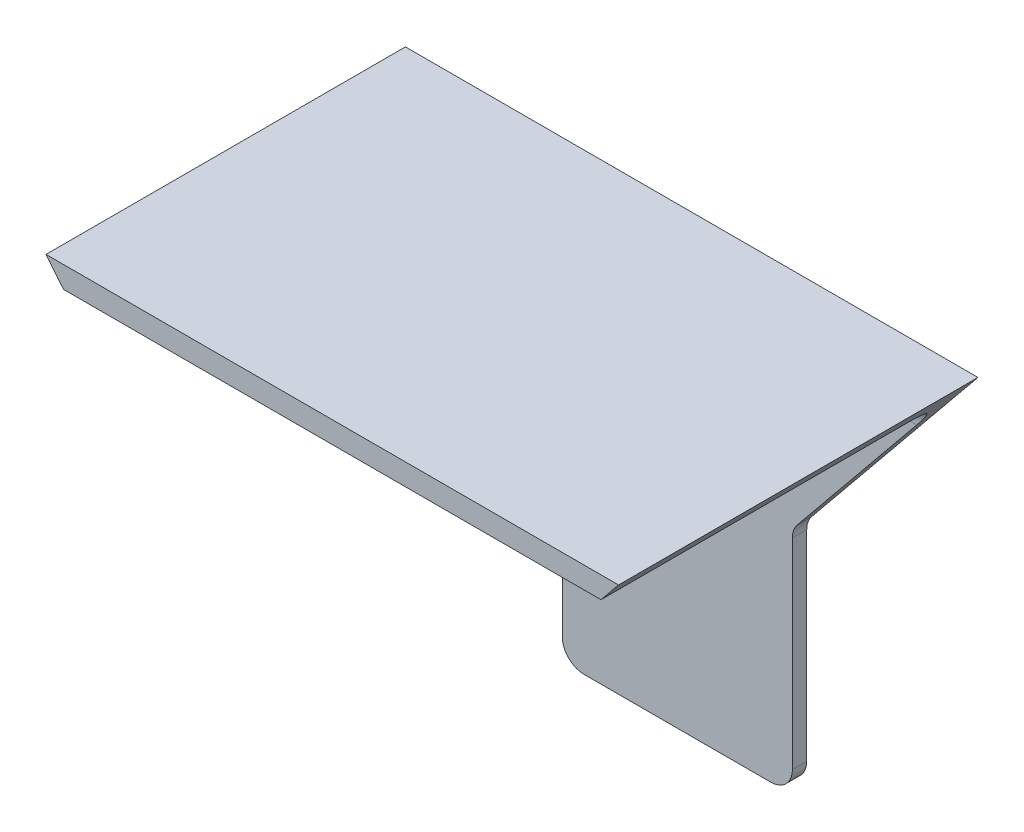
ISO-10303-21;
HEADER;
FILE_DESCRIPTION(('STEP AP214'),'2;1');
FILE_NAME('part.step','',(''),(''),'','','');
FILE_SCHEMA(('AUTOMOTIVE_DESIGN { 1 0 10303 214 1 1 1 1 }'));
ENDSEC;
DATA;
#1=APPLICATION_CONTEXT('core data for automotive mechanical design processes');
#2=APPLICATION_PROTOCOL_DEFINITION('international standard','automotive_design',2000,#1);
#3=PRODUCT_CONTEXT('',#1,'mechanical');
#4=PRODUCT('Part','Part','',(#3));
#5=PRODUCT_RELATED_PRODUCT_CATEGORY('part','',(#4));
#6=PRODUCT_DEFINITION_FORMATION('','',#4);
#7=PRODUCT_DEFINITION_CONTEXT('part definition',#1,'design');
#8=PRODUCT_DEFINITION('design','',#6,#7);
#9=PRODUCT_DEFINITION_SHAPE('','',#8);
#10=(LENGTH_UNIT() NAMED_UNIT(*) SI_UNIT(.MILLI.,.METRE.));
#11=(NAMED_UNIT(*) PLANE_ANGLE_UNIT() SI_UNIT($,.RADIAN.));
#12=(NAMED_UNIT(*) SI_UNIT($,.STERADIAN.) SOLID_ANGLE_UNIT());
#13=UNCERTAINTY_MEASURE_WITH_UNIT(LENGTH_MEASURE(1.E-05),#10,'distance_accuracy_value','');
#14=(GEOMETRIC_REPRESENTATION_CONTEXT(3) GLOBAL_UNCERTAINTY_ASSIGNED_CONTEXT((#13)) GLOBAL_UNIT_ASSIGNED_CONTEXT((#10,
#11,#12)) REPRESENTATION_CONTEXT('',''));
#15=CARTESIAN_POINT('',(0.,0.,0.));
#16=DIRECTION('',(0.,0.,1.));
#17=DIRECTION('',(1.,0.,0.));
#18=AXIS2_PLACEMENT_3D('',#15,#16,#17);
#19=CARTESIAN_POINT('',(44.8949208719906,-31.5432386260104,57.6015500828324));
#20=DIRECTION('',(0.,0.,-1.));
#21=DIRECTION('',(-1.,0.,0.));
#22=AXIS2_PLACEMENT_3D('',#19,#20,#21);
#23=CYLINDRICAL_SURFACE('',#22,3.);
#24=CARTESIAN_POINT('',(44.8949208719906,-31.5432386260104,55.6015500828324));
#25=DIRECTION('',(0.,0.,1.));
#26=DIRECTION('',(1.,0.,0.));
#27=AXIS2_PLACEMENT_3D('',#24,#25,#26);
#28=CIRCLE('',#27,3.);
#29=CARTESIAN_POINT('',(41.8949208719906,-31.5432386260104,55.6015500828324));
#30=VERTEX_POINT('',#29);
#31=CARTESIAN_POINT('',(44.8949208719906,-34.5432386260104,55.6015500828324));
#32=VERTEX_POINT('',#31);
#33=EDGE_CURVE('E160',#30,#32,#28,.T.);
#34=ORIENTED_EDGE('',*,*,#33,.T.);
#35=DIRECTION('',(0.,0.,-1.));
#36=VECTOR('',#35,1.);
#37=CARTESIAN_POINT('',(44.8949208719906,-34.5432386260104,57.6015500828324));
#38=LINE('',#37,#36);
#39=CARTESIAN_POINT('',(44.8949208719906,-34.5432386260104,57.6015500828324));
#40=VERTEX_POINT('',#39);
#41=EDGE_CURVE('E263',#40,#32,#38,.T.);
#42=ORIENTED_EDGE('',*,*,#41,.F.);
#43=CARTESIAN_POINT('',(44.8949208719906,-31.5432386260104,57.6015500828324));
#44=DIRECTION('',(0.,0.,1.));
#45=DIRECTION('',(1.,0.,0.));
#46=AXIS2_PLACEMENT_3D('',#43,#44,#45);
#47=CIRCLE('',#46,3.);
#48=CARTESIAN_POINT('',(41.8949208719906,-31.5432386260104,57.6015500828324));
#49=VERTEX_POINT('',#48);
#50=EDGE_CURVE('E173',#49,#40,#47,.T.);
#51=ORIENTED_EDGE('',*,*,#50,.F.);
#52=DIRECTION('',(0.,0.,-1.));
#53=VECTOR('',#52,1.);
#54=CARTESIAN_POINT('',(41.8949208719906,-31.5432386260104,57.6015500828324));
#55=LINE('',#54,#53);
#56=EDGE_CURVE('E201',#49,#30,#55,.T.);
#57=ORIENTED_EDGE('',*,*,#56,.T.);
#58=EDGE_LOOP('',(#34,#42,#51,#57));
#59=FACE_BOUND('',#58,.T.);
#60=ADVANCED_FACE('F38',(#59),#23,.T.);
#61=CARTESIAN_POINT('',(44.8949208719906,-34.5432386260104,57.6015500828324));
#62=DIRECTION('',(0.,1.,0.));
#63=DIRECTION('',(0.,0.,1.));
#64=AXIS2_PLACEMENT_3D('',#61,#62,#63);
#65=PLANE('',#64);
#66=DIRECTION('',(1.,0.,0.));
#67=VECTOR('',#66,1.);
#68=CARTESIAN_POINT('',(44.8949208719906,-34.5432386260104,55.6015500828324));
#69=LINE('',#68,#67);
#70=CARTESIAN_POINT('',(70.8949208719906,-34.5432386260104,55.6015500828324));
#71=VERTEX_POINT('',#70);
#72=EDGE_CURVE('E165',#32,#71,#69,.T.);
#73=ORIENTED_EDGE('',*,*,#72,.T.);
#74=DIRECTION('',(0.,0.,-1.));
#75=VECTOR('',#74,1.);
#76=CARTESIAN_POINT('',(70.8949208719906,-34.5432386260104,57.6015500828324));
#77=LINE('',#76,#75);
#78=CARTESIAN_POINT('',(70.8949208719906,-34.5432386260104,57.6015500828324));
#79=VERTEX_POINT('',#78);
#80=EDGE_CURVE('E259',#79,#71,#77,.T.);
#81=ORIENTED_EDGE('',*,*,#80,.F.);
#82=DIRECTION('',(1.,0.,0.));
#83=VECTOR('',#82,1.);
#84=CARTESIAN_POINT('',(44.8949208719906,-34.5432386260104,57.6015500828324));
#85=LINE('',#84,#83);
#86=EDGE_CURVE('E177',#40,#79,#85,.T.);
#87=ORIENTED_EDGE('',*,*,#86,.F.);
#88=ORIENTED_EDGE('',*,*,#41,.T.);
#89=EDGE_LOOP('',(#73,#81,#87,#88));
#90=FACE_BOUND('',#89,.T.);
#91=ADVANCED_FACE('F301',(#90),#65,.F.);
#92=CARTESIAN_POINT('',(70.8949208719906,-31.5432386260104,57.6015500828324));
#93=DIRECTION('',(0.,0.,-1.));
#94=DIRECTION('',(-1.,0.,0.));
#95=AXIS2_PLACEMENT_3D('',#92,#93,#94);
#96=CYLINDRICAL_SURFACE('',#95,3.);
#97=CARTESIAN_POINT('',(70.8949208719906,-31.5432386260104,55.6015500828324));
#98=DIRECTION('',(0.,0.,1.));
#99=DIRECTION('',(1.,0.,0.));
#100=AXIS2_PLACEMENT_3D('',#97,#98,#99);
#101=CIRCLE('',#100,3.);
#102=CARTESIAN_POINT('',(73.8949208719906,-31.5432386260104,55.6015500828324));
#103=VERTEX_POINT('',#102);
#104=EDGE_CURVE('E205',#71,#103,#101,.T.);
#105=ORIENTED_EDGE('',*,*,#104,.T.);
#106=DIRECTION('',(0.,0.,-1.));
#107=VECTOR('',#106,1.);
#108=CARTESIAN_POINT('',(73.8949208719906,-31.5432386260104,57.6015500828324));
#109=LINE('',#108,#107);
#110=CARTESIAN_POINT('',(73.8949208719906,-31.5432386260104,57.6015500828324));
#111=VERTEX_POINT('',#110);
#112=EDGE_CURVE('E255',#111,#103,#109,.T.);
#113=ORIENTED_EDGE('',*,*,#112,.F.);
#114=CARTESIAN_POINT('',(70.8949208719906,-31.5432386260104,57.6015500828324));
#115=DIRECTION('',(0.,0.,1.));
#116=DIRECTION('',(1.,0.,0.));
#117=AXIS2_PLACEMENT_3D('',#114,#115,#116);
#118=CIRCLE('',#117,3.);
#119=EDGE_CURVE('E181',#79,#111,#118,.T.);
#120=ORIENTED_EDGE('',*,*,#119,.F.);
#121=ORIENTED_EDGE('',*,*,#80,.T.);
#122=EDGE_LOOP('',(#105,#113,#120,#121));
#123=FACE_BOUND('',#122,.T.);
#124=ADVANCED_FACE('F306',(#123),#96,.T.);
#125=CARTESIAN_POINT('',(73.8949208719906,-31.5432386260104,57.6015500828324));
#126=DIRECTION('',(-1.,0.,0.));
#127=DIRECTION('',(0.,0.,1.));
#128=AXIS2_PLACEMENT_3D('',#125,#126,#127);
#129=PLANE('',#128);
#130=DIRECTION('',(0.,1.,0.));
#131=VECTOR('',#130,1.);
#132=CARTESIAN_POINT('',(73.8949208719906,-31.5432386260104,55.6015500828324));
#133=LINE('',#132,#131);
#134=CARTESIAN_POINT('',(73.8949208719906,-3.61259301136488,55.6015500828324));
#135=VERTEX_POINT('',#134);
#136=EDGE_CURVE('E208',#103,#135,#133,.T.);
#137=ORIENTED_EDGE('',*,*,#136,.T.);
#138=DIRECTION('',(0.,0.,-1.));
#139=VECTOR('',#138,1.);
#140=CARTESIAN_POINT('',(73.8949208719906,-3.61259301136488,57.6015500828324));
#141=LINE('',#140,#139);
#142=CARTESIAN_POINT('',(73.8949208719906,-3.61259301136488,57.6015500828324));
#143=VERTEX_POINT('',#142);
#144=EDGE_CURVE('E251',#143,#135,#141,.T.);
#145=ORIENTED_EDGE('',*,*,#144,.F.);
#146=DIRECTION('',(0.,1.,0.));
#147=VECTOR('',#146,1.);
#148=CARTESIAN_POINT('',(73.8949208719906,-31.5432386260104,57.6015500828324));
#149=LINE('',#148,#147);
#150=EDGE_CURVE('E184',#111,#143,#149,.T.);
#151=ORIENTED_EDGE('',*,*,#150,.F.);
#152=ORIENTED_EDGE('',*,*,#112,.T.);
#153=EDGE_LOOP('',(#137,#145,#151,#152));
#154=FACE_BOUND('',#153,.T.);
#155=ADVANCED_FACE('F312',(#154),#129,.F.);
#156=CARTESIAN_POINT('',(76.8949208719906,-3.61259301136488,57.6015500828324));
#157=DIRECTION('',(0.,0.,-1.));
#158=DIRECTION('',(-1.,0.,0.));
#159=AXIS2_PLACEMENT_3D('',#156,#157,#158);
#160=CYLINDRICAL_SURFACE('',#159,3.);
#161=CARTESIAN_POINT('',(76.8949208719906,-3.61259301136488,55.6015500828324));
#162=DIRECTION('',(0.,0.,-1.));
#163=DIRECTION('',(1.,0.,0.));
#164=AXIS2_PLACEMENT_3D('',#161,#162,#163);
#165=CIRCLE('',#164,3.);
#166=CARTESIAN_POINT('',(74.5713244892306,-1.7149892987776,55.6015500828324));
#167=VERTEX_POINT('',#166);
#168=EDGE_CURVE('E211',#135,#167,#165,.T.);
#169=ORIENTED_EDGE('',*,*,#168,.T.);
#170=DIRECTION('',(0.,0.,-1.));
#171=VECTOR('',#170,1.);
#172=CARTESIAN_POINT('',(74.5713244892306,-1.7149892987776,57.6015500828324));
#173=LINE('',#172,#171);
#174=CARTESIAN_POINT('',(74.5713244892306,-1.7149892987776,57.6015500828324));
#175=VERTEX_POINT('',#174);
#176=EDGE_CURVE('E247',#175,#167,#173,.T.);
#177=ORIENTED_EDGE('',*,*,#176,.F.);
#178=CARTESIAN_POINT('',(76.8949208719906,-3.61259301136488,57.6015500828324));
#179=DIRECTION('',(0.,0.,-1.));
#180=DIRECTION('',(1.,0.,0.));
#181=AXIS2_PLACEMENT_3D('',#178,#179,#180);
#182=CIRCLE('',#181,3.);
#183=EDGE_CURVE('E187',#143,#175,#182,.T.);
#184=ORIENTED_EDGE('',*,*,#183,.F.);
#185=ORIENTED_EDGE('',*,*,#144,.T.);
#186=EDGE_LOOP('',(#169,#177,#184,#185));
#187=FACE_BOUND('',#186,.T.);
#188=ADVANCED_FACE('F316',(#187),#160,.F.);
#189=CARTESIAN_POINT('',(74.5713244892306,-1.71498929877761,57.6015500828324));
#190=DIRECTION('',(-0.774532127586642,0.632534570862423,0.));
#191=DIRECTION('',(-0.632534570862423,-0.774532127586642,0.));
#192=AXIS2_PLACEMENT_3D('',#189,#190,#191);
#193=PLANE('',#192);
#194=DIRECTION('',(0.632534570862423,0.774532127586642,0.));
#195=VECTOR('',#194,1.);
#196=CARTESIAN_POINT('',(74.5713244892306,-1.71498929877761,55.6015500828324));
#197=LINE('',#196,#195);
#198=CARTESIAN_POINT('',(97.7185172547505,26.6285120467569,55.6015500828324));
#199=VERTEX_POINT('',#198);
#200=EDGE_CURVE('E214',#167,#199,#197,.T.);
#201=ORIENTED_EDGE('',*,*,#200,.T.);
#202=DIRECTION('',(0.,0.,-1.));
#203=VECTOR('',#202,1.);
#204=CARTESIAN_POINT('',(97.7185172547505,26.6285120467569,57.6015500828324));
#205=LINE('',#204,#203);
#206=CARTESIAN_POINT('',(97.7185172547505,26.6285120467569,105.601550082832));
#207=VERTEX_POINT('',#206);
#208=EDGE_CURVE('E243',#207,#199,#205,.T.);
#209=ORIENTED_EDGE('',*,*,#208,.F.);
#210=DIRECTION('',(0.632534570862424,0.774532127586641,0.));
#211=VECTOR('',#210,1.);
#212=CARTESIAN_POINT('',(95.2685172547505,23.6285120467569,105.601550082832));
#213=LINE('',#212,#211);
#214=CARTESIAN_POINT('',(95.2685172547505,23.6285120467569,105.601550082832));
#215=VERTEX_POINT('',#214);
#216=EDGE_CURVE('E154',#215,#207,#213,.T.);
#217=ORIENTED_EDGE('',*,*,#216,.F.);
#218=DIRECTION('',(0.,0.,-1.));
#219=VECTOR('',#218,1.);
#220=CARTESIAN_POINT('',(95.2685172547505,23.6285120467569,185.305221989639));
#221=LINE('',#220,#219);
#222=CARTESIAN_POINT('',(95.2685172547505,23.6285120467569,62.6015500828324));
#223=VERTEX_POINT('',#222);
#224=EDGE_CURVE('E146',#215,#223,#221,.T.);
#225=ORIENTED_EDGE('',*,*,#224,.T.);
#226=CARTESIAN_POINT('',(91.1851839214171,18.6285120467569,62.6015500828324));
#227=DIRECTION('',(-0.774532127586642,0.632534570862423,0.));
#228=DIRECTION('',(0.632534570862423,0.774532127586642,0.));
#229=AXIS2_PLACEMENT_3D('',#226,#227,#228);
#230=ELLIPSE('',#229,6.45551013562144,5.);
#231=CARTESIAN_POINT('',(91.1851839214171,18.6285120467569,57.6015500828324));
#232=VERTEX_POINT('',#231);
#233=EDGE_CURVE('E47',#223,#232,#230,.T.);
#234=ORIENTED_EDGE('',*,*,#233,.T.);
#235=DIRECTION('',(0.632534570862423,0.774532127586642,0.));
#236=VECTOR('',#235,1.);
#237=CARTESIAN_POINT('',(74.5713244892306,-1.71498929877761,57.6015500828324));
#238=LINE('',#237,#236);
#239=EDGE_CURVE('E190',#175,#232,#238,.T.);
#240=ORIENTED_EDGE('',*,*,#239,.F.);
#241=ORIENTED_EDGE('',*,*,#176,.T.);
#242=EDGE_LOOP('',(#201,#209,#217,#225,#234,#240,#241));
#243=FACE_BOUND('',#242,.T.);
#244=ADVANCED_FACE('F273',(#243),#193,.F.);
#245=CARTESIAN_POINT('',(21.9446305706035,26.6285120467569,57.6015500828324));
#246=DIRECTION('',(0.,-1.,0.));
#247=DIRECTION('',(0.,0.,-1.));
#248=AXIS2_PLACEMENT_3D('',#245,#246,#247);
#249=PLANE('',#248);
#250=DIRECTION('',(-1.,0.,0.));
#251=VECTOR('',#250,1.);
#252=CARTESIAN_POINT('',(21.9446305706035,26.6285120467569,55.6015500828324));
#253=LINE('',#252,#251);
#254=CARTESIAN_POINT('',(18.0713244892306,26.6285120467569,55.6015500828324));
#255=VERTEX_POINT('',#254);
#256=EDGE_CURVE('E218',#199,#255,#253,.T.);
#257=ORIENTED_EDGE('',*,*,#256,.T.);
#258=DIRECTION('',(0.,0.,-1.));
#259=VECTOR('',#258,1.);
#260=CARTESIAN_POINT('',(18.0713244892306,26.6285120467569,57.6015500828324));
#261=LINE('',#260,#259);
#262=CARTESIAN_POINT('',(18.0713244892306,26.6285120467569,105.601550082832));
#263=VERTEX_POINT('',#262);
#264=EDGE_CURVE('E240',#263,#255,#261,.T.);
#265=ORIENTED_EDGE('',*,*,#264,.F.);
#266=DIRECTION('',(-1.,0.,0.));
#267=VECTOR('',#266,1.);
#268=CARTESIAN_POINT('',(97.7185172547505,26.6285120467569,105.601550082832));
#269=LINE('',#268,#267);
#270=EDGE_CURVE('E158',#207,#263,#269,.T.);
#271=ORIENTED_EDGE('',*,*,#270,.F.);
#272=ORIENTED_EDGE('',*,*,#208,.T.);
#273=EDGE_LOOP('',(#257,#265,#271,#272));
#274=FACE_BOUND('',#273,.T.);
#275=ADVANCED_FACE('F276',(#274),#249,.F.);
#276=CARTESIAN_POINT('',(18.0713244892306,26.6285120467569,57.6015500828324));
#277=DIRECTION('',(0.774532127586641,0.632534570862424,0.));
#278=DIRECTION('',(-0.632534570862424,0.774532127586642,0.));
#279=AXIS2_PLACEMENT_3D('',#276,#277,#278);
#280=PLANE('',#279);
#281=DIRECTION('',(0.632534570862424,-0.774532127586642,0.));
#282=VECTOR('',#281,1.);
#283=CARTESIAN_POINT('',(18.0713244892306,26.6285120467569,55.6015500828324));
#284=LINE('',#283,#282);
#285=CARTESIAN_POINT('',(41.2185172547505,-1.71498929877761,55.6015500828324));
#286=VERTEX_POINT('',#285);
#287=EDGE_CURVE('E221',#255,#286,#284,.T.);
#288=ORIENTED_EDGE('',*,*,#287,.T.);
#289=DIRECTION('',(0.,0.,-1.));
#290=VECTOR('',#289,1.);
#291=CARTESIAN_POINT('',(41.2185172547505,-1.71498929877761,57.6015500828324));
#292=LINE('',#291,#290);
#293=CARTESIAN_POINT('',(41.2185172547505,-1.71498929877761,57.6015500828324));
#294=VERTEX_POINT('',#293);
#295=EDGE_CURVE('E236',#294,#286,#292,.T.);
#296=ORIENTED_EDGE('',*,*,#295,.F.);
#297=DIRECTION('',(0.632534570862424,-0.774532127586642,0.));
#298=VECTOR('',#297,1.);
#299=CARTESIAN_POINT('',(18.0713244892306,26.6285120467569,57.6015500828324));
#300=LINE('',#299,#298);
#301=CARTESIAN_POINT('',(24.604657822564,18.6285120467569,57.6015500828324));
#302=VERTEX_POINT('',#301);
#303=EDGE_CURVE('E193',#302,#294,#300,.T.);
#304=ORIENTED_EDGE('',*,*,#303,.F.);
#305=CARTESIAN_POINT('',(24.604657822564,18.6285120467569,62.6015500828324));
#306=DIRECTION('',(0.774532127586641,0.632534570862424,0.));
#307=DIRECTION('',(0.632534570862424,-0.774532127586642,0.));
#308=AXIS2_PLACEMENT_3D('',#305,#306,#307);
#309=ELLIPSE('',#308,6.45551013562144,5.);
#310=CARTESIAN_POINT('',(20.5213244892306,23.6285120467569,62.6015500828324));
#311=VERTEX_POINT('',#310);
#312=EDGE_CURVE('E11',#302,#311,#309,.T.);
#313=ORIENTED_EDGE('',*,*,#312,.T.);
#314=DIRECTION('',(0.,0.,-1.));
#315=VECTOR('',#314,1.);
#316=CARTESIAN_POINT('',(20.5213244892306,23.6285120467569,185.305221989639));
#317=LINE('',#316,#315);
#318=CARTESIAN_POINT('',(20.5213244892306,23.6285120467569,105.601550082832));
#319=VERTEX_POINT('',#318);
#320=EDGE_CURVE('E133',#319,#311,#317,.T.);
#321=ORIENTED_EDGE('',*,*,#320,.F.);
#322=DIRECTION('',(0.632534570862424,-0.774532127586641,0.));
#323=VECTOR('',#322,1.);
#324=CARTESIAN_POINT('',(18.0713244892306,26.6285120467569,105.601550082832));
#325=LINE('',#324,#323);
#326=EDGE_CURVE('E138',#263,#319,#325,.T.);
#327=ORIENTED_EDGE('',*,*,#326,.F.);
#328=ORIENTED_EDGE('',*,*,#264,.T.);
#329=EDGE_LOOP('',(#288,#296,#304,#313,#321,#327,#328));
#330=FACE_BOUND('',#329,.T.);
#331=ADVANCED_FACE('F135',(#330),#280,.F.);
#332=CARTESIAN_POINT('',(38.8949208719906,-3.61259301136488,57.6015500828324));
#333=DIRECTION('',(0.,0.,-1.));
#334=DIRECTION('',(-1.,0.,0.));
#335=AXIS2_PLACEMENT_3D('',#332,#333,#334);
#336=CYLINDRICAL_SURFACE('',#335,2.99999999999999);
#337=CARTESIAN_POINT('',(38.8949208719906,-3.61259301136488,55.6015500828324));
#338=DIRECTION('',(0.,0.,-1.));
#339=DIRECTION('',(1.,0.,0.));
#340=AXIS2_PLACEMENT_3D('',#337,#338,#339);
#341=CIRCLE('',#340,2.99999999999999);
#342=CARTESIAN_POINT('',(41.8949208719906,-3.61259301136488,55.6015500828324));
#343=VERTEX_POINT('',#342);
#344=EDGE_CURVE('E224',#286,#343,#341,.T.);
#345=ORIENTED_EDGE('',*,*,#344,.T.);
#346=DIRECTION('',(0.,0.,-1.));
#347=VECTOR('',#346,1.);
#348=CARTESIAN_POINT('',(41.8949208719906,-3.61259301136488,57.6015500828324));
#349=LINE('',#348,#347);
#350=CARTESIAN_POINT('',(41.8949208719906,-3.61259301136488,57.6015500828324));
#351=VERTEX_POINT('',#350);
#352=EDGE_CURVE('E232',#351,#343,#349,.T.);
#353=ORIENTED_EDGE('',*,*,#352,.F.);
#354=CARTESIAN_POINT('',(38.8949208719906,-3.61259301136488,57.6015500828324));
#355=DIRECTION('',(0.,0.,-1.));
#356=DIRECTION('',(1.,0.,0.));
#357=AXIS2_PLACEMENT_3D('',#354,#355,#356);
#358=CIRCLE('',#357,2.99999999999999);
#359=EDGE_CURVE('E196',#294,#351,#358,.T.);
#360=ORIENTED_EDGE('',*,*,#359,.F.);
#361=ORIENTED_EDGE('',*,*,#295,.T.);
#362=EDGE_LOOP('',(#345,#353,#360,#361));
#363=FACE_BOUND('',#362,.T.);
#364=ADVANCED_FACE('F286',(#363),#336,.F.);
#365=CARTESIAN_POINT('',(41.8949208719906,-3.61259301136488,57.6015500828324));
#366=DIRECTION('',(1.,0.,0.));
#367=DIRECTION('',(0.,1.,0.));
#368=AXIS2_PLACEMENT_3D('',#365,#366,#367);
#369=PLANE('',#368);
#370=DIRECTION('',(0.,-1.,0.));
#371=VECTOR('',#370,1.);
#372=CARTESIAN_POINT('',(41.8949208719906,-3.61259301136488,55.6015500828324));
#373=LINE('',#372,#371);
#374=EDGE_CURVE('E178',#343,#30,#373,.T.);
#375=ORIENTED_EDGE('',*,*,#374,.T.);
#376=ORIENTED_EDGE('',*,*,#56,.F.);
#377=DIRECTION('',(0.,-1.,0.));
#378=VECTOR('',#377,1.);
#379=CARTESIAN_POINT('',(41.8949208719906,-3.61259301136488,57.6015500828324));
#380=LINE('',#379,#378);
#381=EDGE_CURVE('E199',#351,#49,#380,.T.);
#382=ORIENTED_EDGE('',*,*,#381,.F.);
#383=ORIENTED_EDGE('',*,*,#352,.T.);
#384=EDGE_LOOP('',(#375,#376,#382,#383));
#385=FACE_BOUND('',#384,.T.);
#386=ADVANCED_FACE('F290',(#385),#369,.F.);
#387=CARTESIAN_POINT('',(44.8949208719906,-31.5432386260104,57.6015500828324));
#388=DIRECTION('',(0.,0.,1.));
#389=DIRECTION('',(1.,0.,0.));
#390=AXIS2_PLACEMENT_3D('',#387,#388,#389);
#391=PLANE('',#390);
#392=ORIENTED_EDGE('',*,*,#239,.T.);
#393=DIRECTION('',(1.,0.,0.));
#394=VECTOR('',#393,1.);
#395=CARTESIAN_POINT('',(44.8949208719906,18.6285120467569,57.6015500828324));
#396=LINE('',#395,#394);
#397=EDGE_CURVE('E60',#232,#302,#396,.F.);
#398=ORIENTED_EDGE('',*,*,#397,.T.);
#399=ORIENTED_EDGE('',*,*,#303,.T.);
#400=ORIENTED_EDGE('',*,*,#359,.T.);
#401=ORIENTED_EDGE('',*,*,#381,.T.);
#402=ORIENTED_EDGE('',*,*,#50,.T.);
#403=ORIENTED_EDGE('',*,*,#86,.T.);
#404=ORIENTED_EDGE('',*,*,#119,.T.);
#405=ORIENTED_EDGE('',*,*,#150,.T.);
#406=ORIENTED_EDGE('',*,*,#183,.T.);
#407=EDGE_LOOP('',(#392,#398,#399,#400,#401,#402,#403,#404,#405,#406));
#408=FACE_BOUND('',#407,.T.);
#409=ADVANCED_FACE('F293',(#408),#391,.T.);
#410=CARTESIAN_POINT('',(44.8949208719906,-31.5432386260104,55.6015500828324));
#411=DIRECTION('',(0.,0.,1.));
#412=DIRECTION('',(1.,0.,0.));
#413=AXIS2_PLACEMENT_3D('',#410,#411,#412);
#414=PLANE('',#413);
#415=ORIENTED_EDGE('',*,*,#33,.F.);
#416=ORIENTED_EDGE('',*,*,#374,.F.);
#417=ORIENTED_EDGE('',*,*,#344,.F.);
#418=ORIENTED_EDGE('',*,*,#287,.F.);
#419=ORIENTED_EDGE('',*,*,#256,.F.);
#420=ORIENTED_EDGE('',*,*,#200,.F.);
#421=ORIENTED_EDGE('',*,*,#168,.F.);
#422=ORIENTED_EDGE('',*,*,#136,.F.);
#423=ORIENTED_EDGE('',*,*,#104,.F.);
#424=ORIENTED_EDGE('',*,*,#72,.F.);
#425=EDGE_LOOP('',(#415,#416,#417,#418,#419,#420,#421,#422,#423,#424));
#426=FACE_BOUND('',#425,.T.);
#427=ADVANCED_FACE('F282',(#426),#414,.F.);
#428=CARTESIAN_POINT('',(20.5213244892306,23.6285120467569,185.305221989639));
#429=DIRECTION('',(0.,1.,0.));
#430=DIRECTION('',(0.,0.,1.));
#431=AXIS2_PLACEMENT_3D('',#428,#429,#430);
#432=PLANE('',#431);
#433=ORIENTED_EDGE('',*,*,#320,.T.);
#434=DIRECTION('',(1.,0.,0.));
#435=VECTOR('',#434,1.);
#436=CARTESIAN_POINT('',(20.5213244892306,23.6285120467569,62.6015500828324));
#437=LINE('',#436,#435);
#438=EDGE_CURVE('E267',#311,#223,#437,.T.);
#439=ORIENTED_EDGE('',*,*,#438,.T.);
#440=ORIENTED_EDGE('',*,*,#224,.F.);
#441=DIRECTION('',(1.,0.,0.));
#442=VECTOR('',#441,1.);
#443=CARTESIAN_POINT('',(20.5213244892306,23.6285120467569,105.601550082832));
#444=LINE('',#443,#442);
#445=EDGE_CURVE('E145',#319,#215,#444,.T.);
#446=ORIENTED_EDGE('',*,*,#445,.F.);
#447=EDGE_LOOP('',(#433,#439,#440,#446));
#448=FACE_BOUND('',#447,.T.);
#449=ADVANCED_FACE('F149',(#448),#432,.F.);
#450=CARTESIAN_POINT('',(95.3949208719921,28.5261157593442,105.601550082832));
#451=DIRECTION('',(0.,0.,1.));
#452=DIRECTION('',(1.,0.,0.));
#453=AXIS2_PLACEMENT_3D('',#450,#451,#452);
#454=PLANE('',#453);
#455=ORIENTED_EDGE('',*,*,#445,.T.);
#456=ORIENTED_EDGE('',*,*,#216,.T.);
#457=ORIENTED_EDGE('',*,*,#270,.T.);
#458=ORIENTED_EDGE('',*,*,#326,.T.);
#459=EDGE_LOOP('',(#455,#456,#457,#458));
#460=FACE_BOUND('',#459,.T.);
#461=ADVANCED_FACE('F156',(#460),#454,.T.);
#462=CARTESIAN_POINT('',(20.5213244892306,18.6285120467569,62.6015500828324));
#463=DIRECTION('',(1.,0.,0.));
#464=DIRECTION('',(0.,0.,-1.));
#465=AXIS2_PLACEMENT_3D('',#462,#463,#464);
#466=CYLINDRICAL_SURFACE('',#465,5.);
#467=ORIENTED_EDGE('',*,*,#312,.F.);
#468=ORIENTED_EDGE('',*,*,#397,.F.);
#469=ORIENTED_EDGE('',*,*,#233,.F.);
#470=ORIENTED_EDGE('',*,*,#438,.F.);
#471=EDGE_LOOP('',(#467,#468,#469,#470));
#472=FACE_BOUND('',#471,.T.);
#473=ADVANCED_FACE('F40',(#472),#466,.F.);
#474=CLOSED_SHELL('',(#60,#91,#124,#155,#188,#244,#275,#331,#364,#386,#409,#427,#449,#461,#473));
#475=MANIFOLD_SOLID_BREP('B2',#474);
#476=ADVANCED_BREP_SHAPE_REPRESENTATION('',(#18,#475),#14);
#477=SHAPE_DEFINITION_REPRESENTATION(#9,#476);
ENDSEC;
END-ISO-10303-21;
